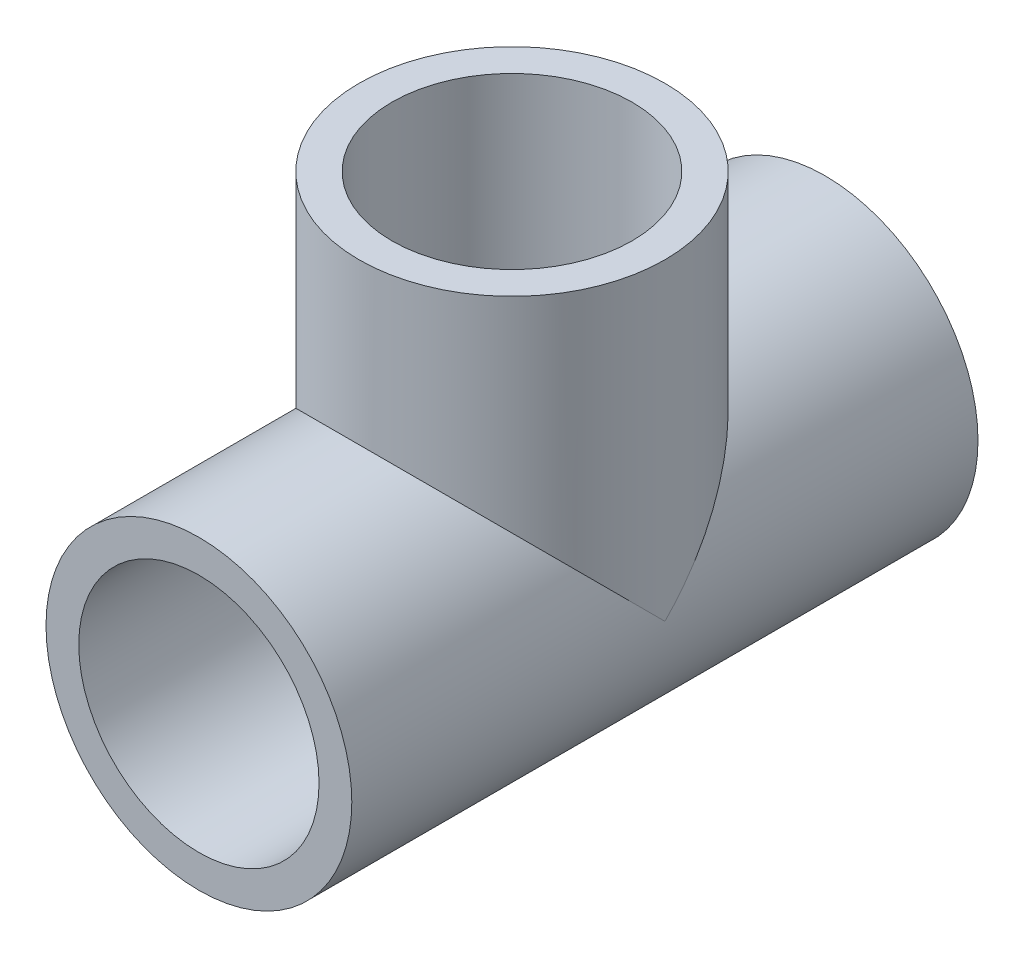
ISO-10303-21;
HEADER;
FILE_DESCRIPTION(('STEP AP214'),'2;1');
FILE_NAME('part.step','',(''),(''),'','','');
FILE_SCHEMA(('AUTOMOTIVE_DESIGN { 1 0 10303 214 1 1 1 1 }'));
ENDSEC;
DATA;
#1=APPLICATION_CONTEXT('core data for automotive mechanical design processes');
#2=APPLICATION_PROTOCOL_DEFINITION('international standard','automotive_design',2000,#1);
#3=PRODUCT_CONTEXT('',#1,'mechanical');
#4=PRODUCT('Part','Part','',(#3));
#5=PRODUCT_RELATED_PRODUCT_CATEGORY('part','',(#4));
#6=PRODUCT_DEFINITION_FORMATION('','',#4);
#7=PRODUCT_DEFINITION_CONTEXT('part definition',#1,'design');
#8=PRODUCT_DEFINITION('design','',#6,#7);
#9=PRODUCT_DEFINITION_SHAPE('','',#8);
#10=(LENGTH_UNIT() NAMED_UNIT(*) SI_UNIT(.MILLI.,.METRE.));
#11=(NAMED_UNIT(*) PLANE_ANGLE_UNIT() SI_UNIT($,.RADIAN.));
#12=(NAMED_UNIT(*) SI_UNIT($,.STERADIAN.) SOLID_ANGLE_UNIT());
#13=UNCERTAINTY_MEASURE_WITH_UNIT(LENGTH_MEASURE(1.E-05),#10,'distance_accuracy_value','');
#14=(GEOMETRIC_REPRESENTATION_CONTEXT(3) GLOBAL_UNCERTAINTY_ASSIGNED_CONTEXT((#13)) GLOBAL_UNIT_ASSIGNED_CONTEXT((#10,
#11,#12)) REPRESENTATION_CONTEXT('',''));
#15=CARTESIAN_POINT('',(0.,0.,0.));
#16=DIRECTION('',(0.,0.,1.));
#17=DIRECTION('',(1.,0.,0.));
#18=AXIS2_PLACEMENT_3D('',#15,#16,#17);
#19=CARTESIAN_POINT('',(0.,-16.66975,0.));
#20=DIRECTION('',(0.,1.,0.));
#21=DIRECTION('',(0.,0.,1.));
#22=AXIS2_PLACEMENT_3D('',#19,#20,#21);
#23=CYLINDRICAL_SURFACE('',#22,12.7);
#24=CARTESIAN_POINT('',(0.,0.,0.));
#25=DIRECTION('',(0.,0.707106781186547,0.707106781186547));
#26=DIRECTION('',(0.,0.707106781186547,-0.707106781186547));
#27=AXIS2_PLACEMENT_3D('',#24,#25,#26);
#28=ELLIPSE('',#27,17.9605122421383,12.7);
#29=CARTESIAN_POINT('',(-12.7,0.,0.));
#30=VERTEX_POINT('',#29);
#31=CARTESIAN_POINT('',(12.7,0.,0.));
#32=VERTEX_POINT('',#31);
#33=EDGE_CURVE('E50',#30,#32,#28,.F.);
#34=ORIENTED_EDGE('',*,*,#33,.T.);
#35=CARTESIAN_POINT('',(0.,0.,0.));
#36=DIRECTION('',(0.,0.707106781186547,-0.707106781186547));
#37=DIRECTION('',(0.,0.707106781186547,0.707106781186547));
#38=AXIS2_PLACEMENT_3D('',#35,#36,#37);
#39=ELLIPSE('',#38,17.9605122421383,12.7);
#40=EDGE_CURVE('E60',#32,#30,#39,.F.);
#41=ORIENTED_EDGE('',*,*,#40,.T.);
#42=EDGE_LOOP('',(#34,#41));
#43=FACE_BOUND('',#42,.T.);
#44=CARTESIAN_POINT('',(0.,15.08125,0.));
#45=DIRECTION('',(0.,1.,0.));
#46=DIRECTION('',(0.,0.,1.));
#47=AXIS2_PLACEMENT_3D('',#44,#45,#46);
#48=CIRCLE('',#47,12.7);
#49=CARTESIAN_POINT('',(0.,15.08125,12.7));
#50=VERTEX_POINT('',#49);
#51=EDGE_CURVE('E38',#50,#50,#48,.F.);
#52=ORIENTED_EDGE('',*,*,#51,.F.);
#53=EDGE_LOOP('',(#52));
#54=FACE_BOUND('',#53,.T.);
#55=ADVANCED_FACE('F34',(#43,#54),#23,.F.);
#56=CARTESIAN_POINT('',(0.,0.,-34.13125));
#57=DIRECTION('',(0.,0.,1.));
#58=DIRECTION('',(1.,0.,0.));
#59=AXIS2_PLACEMENT_3D('',#56,#57,#58);
#60=CYLINDRICAL_SURFACE('',#59,12.7);
#61=CARTESIAN_POINT('',(0.,0.,15.08125));
#62=DIRECTION('',(0.,0.,1.));
#63=DIRECTION('',(1.,0.,0.));
#64=AXIS2_PLACEMENT_3D('',#61,#62,#63);
#65=CIRCLE('',#64,12.7);
#66=CARTESIAN_POINT('',(12.7,0.,15.08125));
#67=VERTEX_POINT('',#66);
#68=EDGE_CURVE('E63',#67,#67,#65,.F.);
#69=ORIENTED_EDGE('',*,*,#68,.F.);
#70=EDGE_LOOP('',(#69));
#71=FACE_BOUND('',#70,.T.);
#72=ORIENTED_EDGE('',*,*,#40,.F.);
#73=ORIENTED_EDGE('',*,*,#33,.F.);
#74=EDGE_LOOP('',(#72,#73));
#75=FACE_BOUND('',#74,.T.);
#76=CARTESIAN_POINT('',(0.,0.,-15.08125));
#77=DIRECTION('',(0.,0.,-1.));
#78=DIRECTION('',(-1.,0.,0.));
#79=AXIS2_PLACEMENT_3D('',#76,#77,#78);
#80=CIRCLE('',#79,12.7);
#81=CARTESIAN_POINT('',(-12.7,0.,-15.08125));
#82=VERTEX_POINT('',#81);
#83=EDGE_CURVE('E84',#82,#82,#80,.F.);
#84=ORIENTED_EDGE('',*,*,#83,.F.);
#85=EDGE_LOOP('',(#84));
#86=FACE_BOUND('',#85,.T.);
#87=ADVANCED_FACE('F65',(#71,#75,#86),#60,.F.);
#88=CARTESIAN_POINT('',(0.,0.,118.243982536796));
#89=DIRECTION('',(0.,0.,-1.));
#90=DIRECTION('',(-1.,0.,0.));
#91=AXIS2_PLACEMENT_3D('',#88,#89,#90);
#92=CYLINDRICAL_SURFACE('',#91,16.66875);
#93=CARTESIAN_POINT('',(0.,0.,0.));
#94=DIRECTION('',(0.,-0.707106781186547,-0.707106781186547));
#95=DIRECTION('',(0.,0.707106781186547,-0.707106781186547));
#96=AXIS2_PLACEMENT_3D('',#93,#94,#95);
#97=ELLIPSE('',#96,23.5731723178065,16.66875);
#98=CARTESIAN_POINT('',(-16.6687499999999,0.,0.));
#99=VERTEX_POINT('',#98);
#100=CARTESIAN_POINT('',(16.66875,0.,0.));
#101=VERTEX_POINT('',#100);
#102=EDGE_CURVE('E43',#99,#101,#97,.T.);
#103=ORIENTED_EDGE('',*,*,#102,.T.);
#104=CARTESIAN_POINT('',(0.,0.,0.));
#105=DIRECTION('',(0.,0.707106781186547,-0.707106781186547));
#106=DIRECTION('',(0.,-0.707106781186547,-0.707106781186547));
#107=AXIS2_PLACEMENT_3D('',#104,#105,#106);
#108=ELLIPSE('',#107,23.5731723178065,16.66875);
#109=EDGE_CURVE('E11',#101,#99,#108,.F.);
#110=ORIENTED_EDGE('',*,*,#109,.T.);
#111=EDGE_LOOP('',(#103,#110));
#112=FACE_BOUND('',#111,.T.);
#113=CARTESIAN_POINT('',(0.,0.,-34.13125));
#114=DIRECTION('',(0.,0.,-1.));
#115=DIRECTION('',(-1.,0.,0.));
#116=AXIS2_PLACEMENT_3D('',#113,#114,#115);
#117=CIRCLE('',#116,16.66875);
#118=CARTESIAN_POINT('',(-16.6687499999999,0.,-34.13125));
#119=VERTEX_POINT('',#118);
#120=EDGE_CURVE('E78',#119,#119,#117,.T.);
#121=ORIENTED_EDGE('',*,*,#120,.F.);
#122=EDGE_LOOP('',(#121));
#123=FACE_BOUND('',#122,.T.);
#124=CARTESIAN_POINT('',(0.,0.,34.13125));
#125=DIRECTION('',(0.,0.,-1.));
#126=DIRECTION('',(-1.,0.,0.));
#127=AXIS2_PLACEMENT_3D('',#124,#125,#126);
#128=CIRCLE('',#127,16.66875);
#129=CARTESIAN_POINT('',(-16.6687499999999,0.,34.13125));
#130=VERTEX_POINT('',#129);
#131=EDGE_CURVE('E70',#130,#130,#128,.T.);
#132=ORIENTED_EDGE('',*,*,#131,.T.);
#133=EDGE_LOOP('',(#132));
#134=FACE_BOUND('',#133,.T.);
#135=ADVANCED_FACE('F36',(#112,#123,#134),#92,.T.);
#136=CARTESIAN_POINT('',(16.66875,0.,-34.13125));
#137=DIRECTION('',(0.,0.,1.));
#138=DIRECTION('',(1.,0.,0.));
#139=AXIS2_PLACEMENT_3D('',#136,#137,#138);
#140=PLANE('',#139);
#141=CARTESIAN_POINT('',(0.,0.,-34.13125));
#142=DIRECTION('',(0.,0.,-1.));
#143=DIRECTION('',(-1.,0.,0.));
#144=AXIS2_PLACEMENT_3D('',#141,#142,#143);
#145=CIRCLE('',#144,13.096875);
#146=CARTESIAN_POINT('',(-13.096875,0.,-34.13125));
#147=VERTEX_POINT('',#146);
#148=EDGE_CURVE('E91',#147,#147,#145,.T.);
#149=ORIENTED_EDGE('',*,*,#148,.F.);
#150=EDGE_LOOP('',(#149));
#151=FACE_BOUND('',#150,.T.);
#152=ORIENTED_EDGE('',*,*,#120,.T.);
#153=EDGE_LOOP('',(#152));
#154=FACE_BOUND('',#153,.T.);
#155=ADVANCED_FACE('F117',(#151,#154),#140,.F.);
#156=CARTESIAN_POINT('',(0.,0.,34.13125));
#157=DIRECTION('',(0.,0.,-1.));
#158=DIRECTION('',(-1.,0.,0.));
#159=AXIS2_PLACEMENT_3D('',#156,#157,#158);
#160=PLANE('',#159);
#161=CARTESIAN_POINT('',(0.,0.,34.13125));
#162=DIRECTION('',(0.,0.,1.));
#163=DIRECTION('',(1.,0.,0.));
#164=AXIS2_PLACEMENT_3D('',#161,#162,#163);
#165=CIRCLE('',#164,13.096875);
#166=CARTESIAN_POINT('',(13.096875,0.,34.13125));
#167=VERTEX_POINT('',#166);
#168=EDGE_CURVE('E73',#167,#167,#165,.T.);
#169=ORIENTED_EDGE('',*,*,#168,.F.);
#170=EDGE_LOOP('',(#169));
#171=FACE_BOUND('',#170,.T.);
#172=ORIENTED_EDGE('',*,*,#131,.F.);
#173=EDGE_LOOP('',(#172));
#174=FACE_BOUND('',#173,.T.);
#175=ADVANCED_FACE('F113',(#171,#174),#160,.F.);
#176=CARTESIAN_POINT('',(0.,0.,0.));
#177=DIRECTION('',(0.,1.,0.));
#178=DIRECTION('',(0.,0.,1.));
#179=AXIS2_PLACEMENT_3D('',#176,#177,#178);
#180=CYLINDRICAL_SURFACE('',#179,16.6687499999999);
#181=CARTESIAN_POINT('',(0.,34.13125,0.));
#182=DIRECTION('',(0.,1.,0.));
#183=DIRECTION('',(0.,0.,1.));
#184=AXIS2_PLACEMENT_3D('',#181,#182,#183);
#185=CIRCLE('',#184,16.66875);
#186=CARTESIAN_POINT('',(0.,34.13125,16.66875));
#187=VERTEX_POINT('',#186);
#188=EDGE_CURVE('E67',#187,#187,#185,.T.);
#189=ORIENTED_EDGE('',*,*,#188,.F.);
#190=EDGE_LOOP('',(#189));
#191=FACE_BOUND('',#190,.T.);
#192=ORIENTED_EDGE('',*,*,#109,.F.);
#193=ORIENTED_EDGE('',*,*,#102,.F.);
#194=EDGE_LOOP('',(#192,#193));
#195=FACE_BOUND('',#194,.T.);
#196=ADVANCED_FACE('F116',(#191,#195),#180,.T.);
#197=CARTESIAN_POINT('',(0.,34.13125,0.));
#198=DIRECTION('',(0.,1.,0.));
#199=DIRECTION('',(0.,0.,1.));
#200=AXIS2_PLACEMENT_3D('',#197,#198,#199);
#201=PLANE('',#200);
#202=CARTESIAN_POINT('',(0.,34.13125,0.));
#203=DIRECTION('',(0.,1.,0.));
#204=DIRECTION('',(0.,0.,1.));
#205=AXIS2_PLACEMENT_3D('',#202,#203,#204);
#206=CIRCLE('',#205,13.096875);
#207=CARTESIAN_POINT('',(0.,34.13125,13.096875));
#208=VERTEX_POINT('',#207);
#209=EDGE_CURVE('E98',#208,#208,#206,.T.);
#210=ORIENTED_EDGE('',*,*,#209,.F.);
#211=EDGE_LOOP('',(#210));
#212=FACE_BOUND('',#211,.T.);
#213=ORIENTED_EDGE('',*,*,#188,.T.);
#214=EDGE_LOOP('',(#213));
#215=FACE_BOUND('',#214,.T.);
#216=ADVANCED_FACE('F139',(#212,#215),#201,.T.);
#217=CARTESIAN_POINT('',(0.,0.,15.08125));
#218=DIRECTION('',(0.,0.,1.));
#219=DIRECTION('',(1.,0.,0.));
#220=AXIS2_PLACEMENT_3D('',#217,#218,#219);
#221=PLANE('',#220);
#222=CARTESIAN_POINT('',(0.,0.,15.08125));
#223=DIRECTION('',(0.,0.,1.));
#224=DIRECTION('',(1.,0.,0.));
#225=AXIS2_PLACEMENT_3D('',#222,#223,#224);
#226=CIRCLE('',#225,13.096875);
#227=CARTESIAN_POINT('',(13.096875,0.,15.08125));
#228=VERTEX_POINT('',#227);
#229=EDGE_CURVE('E83',#228,#228,#226,.T.);
#230=ORIENTED_EDGE('',*,*,#229,.T.);
#231=EDGE_LOOP('',(#230));
#232=FACE_BOUND('',#231,.T.);
#233=ORIENTED_EDGE('',*,*,#68,.T.);
#234=EDGE_LOOP('',(#233));
#235=FACE_BOUND('',#234,.T.);
#236=ADVANCED_FACE('F103',(#232,#235),#221,.T.);
#237=CARTESIAN_POINT('',(0.,0.,15.08125));
#238=DIRECTION('',(0.,0.,1.));
#239=DIRECTION('',(1.,0.,0.));
#240=AXIS2_PLACEMENT_3D('',#237,#238,#239);
#241=CYLINDRICAL_SURFACE('',#240,13.096875);
#242=CARTESIAN_POINT('',(13.096875,0.,15.08125));
#243=CARTESIAN_POINT('',(13.096875,0.,15.2796875));
#244=CARTESIAN_POINT('',(13.096875,0.,15.478125));
#245=CARTESIAN_POINT('',(13.096875,0.,15.875));
#246=CARTESIAN_POINT('',(13.096875,0.,16.0734375));
#247=CARTESIAN_POINT('',(13.096875,0.,16.4703125));
#248=CARTESIAN_POINT('',(13.096875,0.,16.66875));
#249=CARTESIAN_POINT('',(13.096875,0.,17.065625));
#250=CARTESIAN_POINT('',(13.096875,0.,17.2640625));
#251=CARTESIAN_POINT('',(13.096875,0.,17.6609375));
#252=CARTESIAN_POINT('',(13.096875,0.,17.859375));
#253=CARTESIAN_POINT('',(13.096875,0.,18.25625));
#254=CARTESIAN_POINT('',(13.096875,0.,18.4546875));
#255=CARTESIAN_POINT('',(13.096875,0.,18.8515625));
#256=CARTESIAN_POINT('',(13.096875,0.,19.05));
#257=CARTESIAN_POINT('',(13.096875,0.,19.446875));
#258=CARTESIAN_POINT('',(13.096875,0.,19.6453125));
#259=CARTESIAN_POINT('',(13.096875,0.,20.0421875));
#260=CARTESIAN_POINT('',(13.096875,0.,20.240625));
#261=CARTESIAN_POINT('',(13.096875,0.,20.6375));
#262=CARTESIAN_POINT('',(13.096875,0.,20.8359375));
#263=CARTESIAN_POINT('',(13.096875,0.,21.2328125));
#264=CARTESIAN_POINT('',(13.096875,0.,21.43125));
#265=CARTESIAN_POINT('',(13.096875,0.,21.828125));
#266=CARTESIAN_POINT('',(13.096875,0.,22.0265625));
#267=CARTESIAN_POINT('',(13.096875,0.,22.4234375));
#268=CARTESIAN_POINT('',(13.096875,0.,22.621875));
#269=CARTESIAN_POINT('',(13.096875,0.,23.01875));
#270=CARTESIAN_POINT('',(13.096875,0.,23.2171875));
#271=CARTESIAN_POINT('',(13.096875,0.,23.6140625));
#272=CARTESIAN_POINT('',(13.096875,0.,23.8125));
#273=CARTESIAN_POINT('',(13.096875,0.,24.209375));
#274=CARTESIAN_POINT('',(13.096875,0.,24.4078125));
#275=CARTESIAN_POINT('',(13.096875,0.,24.8046875));
#276=CARTESIAN_POINT('',(13.096875,0.,25.003125));
#277=CARTESIAN_POINT('',(13.096875,0.,25.4));
#278=CARTESIAN_POINT('',(13.096875,0.,25.5984375));
#279=CARTESIAN_POINT('',(13.096875,0.,25.9953125));
#280=CARTESIAN_POINT('',(13.096875,0.,26.19375));
#281=CARTESIAN_POINT('',(13.096875,0.,26.590625));
#282=CARTESIAN_POINT('',(13.096875,0.,26.7890625));
#283=CARTESIAN_POINT('',(13.096875,0.,27.1859375));
#284=CARTESIAN_POINT('',(13.096875,0.,27.384375));
#285=CARTESIAN_POINT('',(13.096875,0.,27.78125));
#286=CARTESIAN_POINT('',(13.096875,0.,27.9796875));
#287=CARTESIAN_POINT('',(13.096875,0.,28.3765625));
#288=CARTESIAN_POINT('',(13.096875,0.,28.575));
#289=CARTESIAN_POINT('',(13.096875,0.,28.971875));
#290=CARTESIAN_POINT('',(13.096875,0.,29.1703125));
#291=CARTESIAN_POINT('',(13.096875,0.,29.5671875));
#292=CARTESIAN_POINT('',(13.096875,0.,29.765625));
#293=CARTESIAN_POINT('',(13.096875,0.,30.1625));
#294=CARTESIAN_POINT('',(13.096875,0.,30.3609375));
#295=CARTESIAN_POINT('',(13.096875,0.,30.7578125));
#296=CARTESIAN_POINT('',(13.096875,0.,30.95625));
#297=CARTESIAN_POINT('',(13.096875,0.,31.353125));
#298=CARTESIAN_POINT('',(13.096875,0.,31.5515625));
#299=CARTESIAN_POINT('',(13.096875,0.,31.9484375));
#300=CARTESIAN_POINT('',(13.096875,0.,32.146875));
#301=CARTESIAN_POINT('',(13.096875,0.,32.54375));
#302=CARTESIAN_POINT('',(13.096875,0.,32.7421875));
#303=CARTESIAN_POINT('',(13.096875,0.,33.1390625));
#304=CARTESIAN_POINT('',(13.096875,0.,33.3375));
#305=CARTESIAN_POINT('',(13.096875,0.,33.734375));
#306=CARTESIAN_POINT('',(13.096875,0.,33.9328125));
#307=CARTESIAN_POINT('',(13.096875,0.,34.13125));
#308=B_SPLINE_CURVE_WITH_KNOTS('',3,(#242,#243,#244,#245,#246,#247,#248,#249,#250,#251,#252,
#253,#254,#255,#256,#257,#258,#259,#260,#261,#262,#263,#264,#265,#266,#267,#268,#269,#270,#271,
#272,#273,#274,#275,#276,#277,#278,#279,#280,#281,#282,#283,#284,#285,#286,#287,#288,#289,#290,
#291,#292,#293,#294,#295,#296,#297,#298,#299,#300,#301,#302,#303,#304,#305,#306,#307),
.UNSPECIFIED.,.F.,.F.,(4,2,2,2,2,2,2,2,2,2,2,2,2,2,2,2,2,2,2,2,2,2,2,2,2,2,2,2,2,2,2,2,4),(0.,
0.5953125,1.190625,1.7859375,2.38125,2.9765625,3.571875,4.1671875,4.7625,5.3578125,5.953125,
6.5484375,7.14375,7.7390625,8.33437499999999,8.92968749999999,9.525,10.1203125,10.715625,
11.3109375,11.90625,12.5015625,13.096875,13.6921875,14.2875,14.8828125,15.478125,16.0734375,
16.66875,17.2640625,17.859375,18.4546875,19.05),.UNSPECIFIED.);
#309=EDGE_CURVE('BSEAM106',#228,#167,#308,.T.);
#310=ORIENTED_EDGE('',*,*,#229,.F.);
#311=ORIENTED_EDGE('',*,*,#168,.T.);
#312=ORIENTED_EDGE('',*,*,#309,.T.);
#313=ORIENTED_EDGE('',*,*,#309,.F.);
#314=EDGE_LOOP('',(#310,#312,#311,#313));
#315=FACE_BOUND('',#314,.T.);
#316=ADVANCED_FACE('F106',(#315),#241,.F.);
#317=CARTESIAN_POINT('',(0.,0.,-15.08125));
#318=DIRECTION('',(0.,0.,-1.));
#319=DIRECTION('',(-1.,0.,0.));
#320=AXIS2_PLACEMENT_3D('',#317,#318,#319);
#321=PLANE('',#320);
#322=CARTESIAN_POINT('',(0.,0.,-15.08125));
#323=DIRECTION('',(0.,0.,-1.));
#324=DIRECTION('',(-1.,0.,0.));
#325=AXIS2_PLACEMENT_3D('',#322,#323,#324);
#326=CIRCLE('',#325,13.096875);
#327=CARTESIAN_POINT('',(-13.096875,0.,-15.08125));
#328=VERTEX_POINT('',#327);
#329=EDGE_CURVE('E86',#328,#328,#326,.T.);
#330=ORIENTED_EDGE('',*,*,#329,.T.);
#331=EDGE_LOOP('',(#330));
#332=FACE_BOUND('',#331,.T.);
#333=ORIENTED_EDGE('',*,*,#83,.T.);
#334=EDGE_LOOP('',(#333));
#335=FACE_BOUND('',#334,.T.);
#336=ADVANCED_FACE('F109',(#332,#335),#321,.T.);
#337=CARTESIAN_POINT('',(0.,0.,-15.08125));
#338=DIRECTION('',(0.,0.,-1.));
#339=DIRECTION('',(-1.,0.,0.));
#340=AXIS2_PLACEMENT_3D('',#337,#338,#339);
#341=CYLINDRICAL_SURFACE('',#340,13.096875);
#342=CARTESIAN_POINT('',(-13.096875,0.,-15.08125));
#343=CARTESIAN_POINT('',(-13.096875,0.,-15.2796875));
#344=CARTESIAN_POINT('',(-13.096875,0.,-15.478125));
#345=CARTESIAN_POINT('',(-13.096875,0.,-15.875));
#346=CARTESIAN_POINT('',(-13.096875,0.,-16.0734375));
#347=CARTESIAN_POINT('',(-13.096875,0.,-16.4703125));
#348=CARTESIAN_POINT('',(-13.096875,0.,-16.66875));
#349=CARTESIAN_POINT('',(-13.096875,0.,-17.065625));
#350=CARTESIAN_POINT('',(-13.096875,0.,-17.2640625));
#351=CARTESIAN_POINT('',(-13.096875,0.,-17.6609375));
#352=CARTESIAN_POINT('',(-13.096875,0.,-17.859375));
#353=CARTESIAN_POINT('',(-13.096875,0.,-18.25625));
#354=CARTESIAN_POINT('',(-13.096875,0.,-18.4546875));
#355=CARTESIAN_POINT('',(-13.096875,0.,-18.8515625));
#356=CARTESIAN_POINT('',(-13.096875,0.,-19.05));
#357=CARTESIAN_POINT('',(-13.096875,0.,-19.446875));
#358=CARTESIAN_POINT('',(-13.096875,0.,-19.6453125));
#359=CARTESIAN_POINT('',(-13.096875,0.,-20.0421875));
#360=CARTESIAN_POINT('',(-13.096875,0.,-20.240625));
#361=CARTESIAN_POINT('',(-13.096875,0.,-20.6375));
#362=CARTESIAN_POINT('',(-13.096875,0.,-20.8359375));
#363=CARTESIAN_POINT('',(-13.096875,0.,-21.2328125));
#364=CARTESIAN_POINT('',(-13.096875,0.,-21.43125));
#365=CARTESIAN_POINT('',(-13.096875,0.,-21.828125));
#366=CARTESIAN_POINT('',(-13.096875,0.,-22.0265625));
#367=CARTESIAN_POINT('',(-13.096875,0.,-22.4234375));
#368=CARTESIAN_POINT('',(-13.096875,0.,-22.621875));
#369=CARTESIAN_POINT('',(-13.096875,0.,-23.01875));
#370=CARTESIAN_POINT('',(-13.096875,0.,-23.2171875));
#371=CARTESIAN_POINT('',(-13.096875,0.,-23.6140625));
#372=CARTESIAN_POINT('',(-13.096875,0.,-23.8125));
#373=CARTESIAN_POINT('',(-13.096875,0.,-24.209375));
#374=CARTESIAN_POINT('',(-13.096875,0.,-24.4078125));
#375=CARTESIAN_POINT('',(-13.096875,0.,-24.8046875));
#376=CARTESIAN_POINT('',(-13.096875,0.,-25.003125));
#377=CARTESIAN_POINT('',(-13.096875,0.,-25.4));
#378=CARTESIAN_POINT('',(-13.096875,0.,-25.5984375));
#379=CARTESIAN_POINT('',(-13.096875,0.,-25.9953125));
#380=CARTESIAN_POINT('',(-13.096875,0.,-26.19375));
#381=CARTESIAN_POINT('',(-13.096875,0.,-26.590625));
#382=CARTESIAN_POINT('',(-13.096875,0.,-26.7890625));
#383=CARTESIAN_POINT('',(-13.096875,0.,-27.1859375));
#384=CARTESIAN_POINT('',(-13.096875,0.,-27.384375));
#385=CARTESIAN_POINT('',(-13.096875,0.,-27.78125));
#386=CARTESIAN_POINT('',(-13.096875,0.,-27.9796875));
#387=CARTESIAN_POINT('',(-13.096875,0.,-28.3765625));
#388=CARTESIAN_POINT('',(-13.096875,0.,-28.575));
#389=CARTESIAN_POINT('',(-13.096875,0.,-28.971875));
#390=CARTESIAN_POINT('',(-13.096875,0.,-29.1703125));
#391=CARTESIAN_POINT('',(-13.096875,0.,-29.5671875));
#392=CARTESIAN_POINT('',(-13.096875,0.,-29.765625));
#393=CARTESIAN_POINT('',(-13.096875,0.,-30.1625));
#394=CARTESIAN_POINT('',(-13.096875,0.,-30.3609375));
#395=CARTESIAN_POINT('',(-13.096875,0.,-30.7578125));
#396=CARTESIAN_POINT('',(-13.096875,0.,-30.95625));
#397=CARTESIAN_POINT('',(-13.096875,0.,-31.353125));
#398=CARTESIAN_POINT('',(-13.096875,0.,-31.5515625));
#399=CARTESIAN_POINT('',(-13.096875,0.,-31.9484375));
#400=CARTESIAN_POINT('',(-13.096875,0.,-32.146875));
#401=CARTESIAN_POINT('',(-13.096875,0.,-32.54375));
#402=CARTESIAN_POINT('',(-13.096875,0.,-32.7421875));
#403=CARTESIAN_POINT('',(-13.096875,0.,-33.1390625));
#404=CARTESIAN_POINT('',(-13.096875,0.,-33.3375));
#405=CARTESIAN_POINT('',(-13.096875,0.,-33.734375));
#406=CARTESIAN_POINT('',(-13.096875,0.,-33.9328125));
#407=CARTESIAN_POINT('',(-13.096875,0.,-34.13125));
#408=B_SPLINE_CURVE_WITH_KNOTS('',3,(#342,#343,#344,#345,#346,#347,#348,#349,#350,#351,#352,
#353,#354,#355,#356,#357,#358,#359,#360,#361,#362,#363,#364,#365,#366,#367,#368,#369,#370,#371,
#372,#373,#374,#375,#376,#377,#378,#379,#380,#381,#382,#383,#384,#385,#386,#387,#388,#389,#390,
#391,#392,#393,#394,#395,#396,#397,#398,#399,#400,#401,#402,#403,#404,#405,#406,#407),
.UNSPECIFIED.,.F.,.F.,(4,2,2,2,2,2,2,2,2,2,2,2,2,2,2,2,2,2,2,2,2,2,2,2,2,2,2,2,2,2,2,2,4),(0.,
0.5953125,1.190625,1.7859375,2.38125,2.9765625,3.571875,4.1671875,4.7625,5.3578125,5.953125,
6.5484375,7.14375,7.7390625,8.33437499999999,8.92968749999999,9.525,10.1203125,10.715625,
11.3109375,11.90625,12.5015625,13.096875,13.6921875,14.2875,14.8828125,15.478125,16.0734375,
16.66875,17.2640625,17.859375,18.4546875,19.05),.UNSPECIFIED.);
#409=EDGE_CURVE('BSEAM161',#328,#147,#408,.T.);
#410=ORIENTED_EDGE('',*,*,#329,.F.);
#411=ORIENTED_EDGE('',*,*,#148,.T.);
#412=ORIENTED_EDGE('',*,*,#409,.T.);
#413=ORIENTED_EDGE('',*,*,#409,.F.);
#414=EDGE_LOOP('',(#410,#412,#411,#413));
#415=FACE_BOUND('',#414,.T.);
#416=ADVANCED_FACE('F161',(#415),#341,.F.);
#417=CARTESIAN_POINT('',(0.,15.08125,0.));
#418=DIRECTION('',(0.,1.,0.));
#419=DIRECTION('',(0.,0.,1.));
#420=AXIS2_PLACEMENT_3D('',#417,#418,#419);
#421=PLANE('',#420);
#422=CARTESIAN_POINT('',(0.,15.08125,0.));
#423=DIRECTION('',(0.,1.,0.));
#424=DIRECTION('',(0.,0.,1.));
#425=AXIS2_PLACEMENT_3D('',#422,#423,#424);
#426=CIRCLE('',#425,13.096875);
#427=CARTESIAN_POINT('',(0.,15.08125,13.096875));
#428=VERTEX_POINT('',#427);
#429=EDGE_CURVE('E151',#428,#428,#426,.T.);
#430=ORIENTED_EDGE('',*,*,#429,.T.);
#431=EDGE_LOOP('',(#430));
#432=FACE_BOUND('',#431,.T.);
#433=ORIENTED_EDGE('',*,*,#51,.T.);
#434=EDGE_LOOP('',(#433));
#435=FACE_BOUND('',#434,.T.);
#436=ADVANCED_FACE('F158',(#432,#435),#421,.T.);
#437=CARTESIAN_POINT('',(0.,15.08125,0.));
#438=DIRECTION('',(0.,1.,0.));
#439=DIRECTION('',(0.,0.,1.));
#440=AXIS2_PLACEMENT_3D('',#437,#438,#439);
#441=CYLINDRICAL_SURFACE('',#440,13.096875);
#442=CARTESIAN_POINT('',(0.,15.08125,13.096875));
#443=CARTESIAN_POINT('',(0.,15.2796875,13.096875));
#444=CARTESIAN_POINT('',(0.,15.478125,13.096875));
#445=CARTESIAN_POINT('',(0.,15.875,13.096875));
#446=CARTESIAN_POINT('',(0.,16.0734375,13.096875));
#447=CARTESIAN_POINT('',(0.,16.4703125,13.096875));
#448=CARTESIAN_POINT('',(0.,16.66875,13.096875));
#449=CARTESIAN_POINT('',(0.,17.065625,13.096875));
#450=CARTESIAN_POINT('',(0.,17.2640625,13.096875));
#451=CARTESIAN_POINT('',(0.,17.6609375,13.096875));
#452=CARTESIAN_POINT('',(0.,17.859375,13.096875));
#453=CARTESIAN_POINT('',(0.,18.25625,13.096875));
#454=CARTESIAN_POINT('',(0.,18.4546875,13.096875));
#455=CARTESIAN_POINT('',(0.,18.8515625,13.096875));
#456=CARTESIAN_POINT('',(0.,19.05,13.096875));
#457=CARTESIAN_POINT('',(0.,19.446875,13.096875));
#458=CARTESIAN_POINT('',(0.,19.6453125,13.096875));
#459=CARTESIAN_POINT('',(0.,20.0421875,13.096875));
#460=CARTESIAN_POINT('',(0.,20.240625,13.096875));
#461=CARTESIAN_POINT('',(0.,20.6375,13.096875));
#462=CARTESIAN_POINT('',(0.,20.8359375,13.096875));
#463=CARTESIAN_POINT('',(0.,21.2328125,13.096875));
#464=CARTESIAN_POINT('',(0.,21.43125,13.096875));
#465=CARTESIAN_POINT('',(0.,21.828125,13.096875));
#466=CARTESIAN_POINT('',(0.,22.0265625,13.096875));
#467=CARTESIAN_POINT('',(0.,22.4234375,13.096875));
#468=CARTESIAN_POINT('',(0.,22.621875,13.096875));
#469=CARTESIAN_POINT('',(0.,23.01875,13.096875));
#470=CARTESIAN_POINT('',(0.,23.2171875,13.096875));
#471=CARTESIAN_POINT('',(0.,23.6140625,13.096875));
#472=CARTESIAN_POINT('',(0.,23.8125,13.096875));
#473=CARTESIAN_POINT('',(0.,24.209375,13.096875));
#474=CARTESIAN_POINT('',(0.,24.4078125,13.096875));
#475=CARTESIAN_POINT('',(0.,24.8046875,13.096875));
#476=CARTESIAN_POINT('',(0.,25.003125,13.096875));
#477=CARTESIAN_POINT('',(0.,25.4,13.096875));
#478=CARTESIAN_POINT('',(0.,25.5984375,13.096875));
#479=CARTESIAN_POINT('',(0.,25.9953125,13.096875));
#480=CARTESIAN_POINT('',(0.,26.19375,13.096875));
#481=CARTESIAN_POINT('',(0.,26.590625,13.096875));
#482=CARTESIAN_POINT('',(0.,26.7890625,13.096875));
#483=CARTESIAN_POINT('',(0.,27.1859375,13.096875));
#484=CARTESIAN_POINT('',(0.,27.384375,13.096875));
#485=CARTESIAN_POINT('',(0.,27.78125,13.096875));
#486=CARTESIAN_POINT('',(0.,27.9796875,13.096875));
#487=CARTESIAN_POINT('',(0.,28.3765625,13.096875));
#488=CARTESIAN_POINT('',(0.,28.575,13.096875));
#489=CARTESIAN_POINT('',(0.,28.971875,13.096875));
#490=CARTESIAN_POINT('',(0.,29.1703125,13.096875));
#491=CARTESIAN_POINT('',(0.,29.5671875,13.096875));
#492=CARTESIAN_POINT('',(0.,29.765625,13.096875));
#493=CARTESIAN_POINT('',(0.,30.1625,13.096875));
#494=CARTESIAN_POINT('',(0.,30.3609375,13.096875));
#495=CARTESIAN_POINT('',(0.,30.7578125,13.096875));
#496=CARTESIAN_POINT('',(0.,30.95625,13.096875));
#497=CARTESIAN_POINT('',(0.,31.353125,13.096875));
#498=CARTESIAN_POINT('',(0.,31.5515625,13.096875));
#499=CARTESIAN_POINT('',(0.,31.9484375,13.096875));
#500=CARTESIAN_POINT('',(0.,32.146875,13.096875));
#501=CARTESIAN_POINT('',(0.,32.54375,13.096875));
#502=CARTESIAN_POINT('',(0.,32.7421875,13.096875));
#503=CARTESIAN_POINT('',(0.,33.1390625,13.096875));
#504=CARTESIAN_POINT('',(0.,33.3375,13.096875));
#505=CARTESIAN_POINT('',(0.,33.734375,13.096875));
#506=CARTESIAN_POINT('',(0.,33.9328125,13.096875));
#507=CARTESIAN_POINT('',(0.,34.13125,13.096875));
#508=B_SPLINE_CURVE_WITH_KNOTS('',3,(#442,#443,#444,#445,#446,#447,#448,#449,#450,#451,#452,
#453,#454,#455,#456,#457,#458,#459,#460,#461,#462,#463,#464,#465,#466,#467,#468,#469,#470,#471,
#472,#473,#474,#475,#476,#477,#478,#479,#480,#481,#482,#483,#484,#485,#486,#487,#488,#489,#490,
#491,#492,#493,#494,#495,#496,#497,#498,#499,#500,#501,#502,#503,#504,#505,#506,#507),
.UNSPECIFIED.,.F.,.F.,(4,2,2,2,2,2,2,2,2,2,2,2,2,2,2,2,2,2,2,2,2,2,2,2,2,2,2,2,2,2,2,2,4),(0.,
0.5953125,1.190625,1.7859375,2.38125,2.9765625,3.571875,4.1671875,4.7625,5.3578125,5.953125,
6.5484375,7.14375,7.7390625,8.33437499999999,8.92968749999999,9.525,10.1203125,10.715625,
11.3109375,11.90625,12.5015625,13.096875,13.6921875,14.2875,14.8828125,15.478125,16.0734375,
16.66875,17.2640625,17.859375,18.4546875,19.05),.UNSPECIFIED.);
#509=EDGE_CURVE('BSEAM160',#428,#208,#508,.T.);
#510=ORIENTED_EDGE('',*,*,#429,.F.);
#511=ORIENTED_EDGE('',*,*,#209,.T.);
#512=ORIENTED_EDGE('',*,*,#509,.T.);
#513=ORIENTED_EDGE('',*,*,#509,.F.);
#514=EDGE_LOOP('',(#510,#512,#511,#513));
#515=FACE_BOUND('',#514,.T.);
#516=ADVANCED_FACE('F160',(#515),#441,.F.);
#517=CLOSED_SHELL('',(#55,#87,#135,#155,#175,#196,#216,#236,#316,#336,#416,#436,#516));
#518=MANIFOLD_SOLID_BREP('B2',#517);
#519=ADVANCED_BREP_SHAPE_REPRESENTATION('',(#18,#518),#14);
#520=SHAPE_DEFINITION_REPRESENTATION(#9,#519);
ENDSEC;
END-ISO-10303-21;
